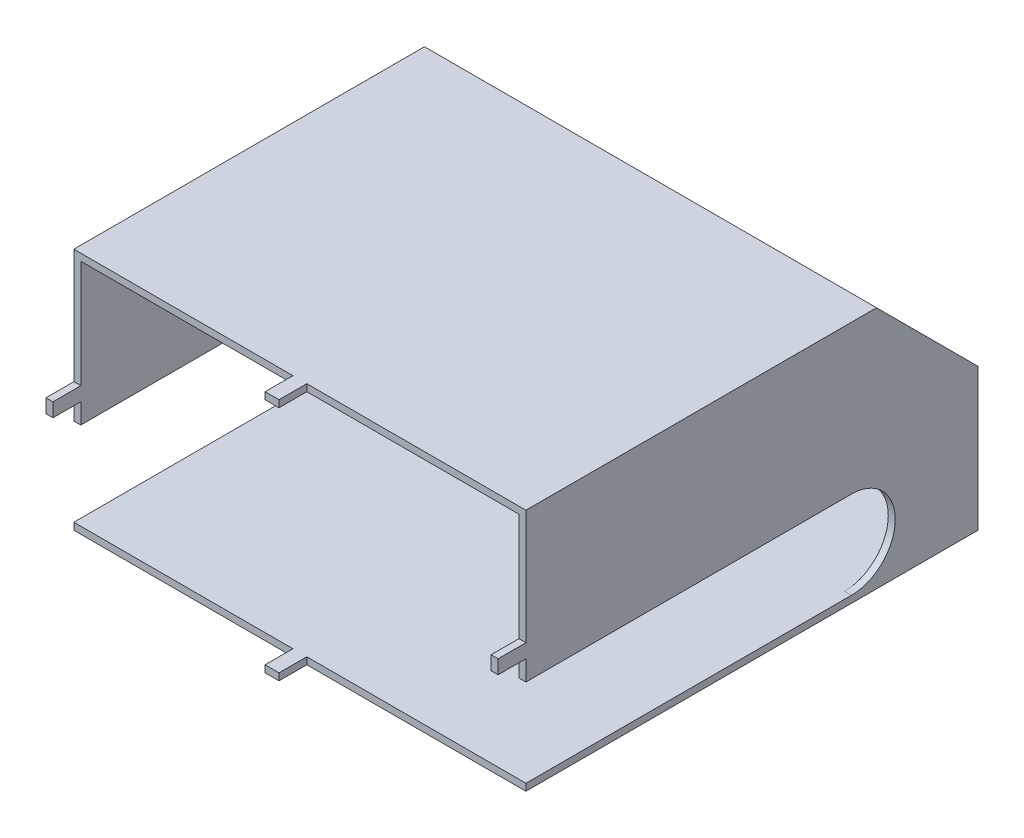
ISO-10303-21;
HEADER;
FILE_DESCRIPTION(('STEP AP214'),'2;1');
FILE_NAME('part.step','',(''),(''),'','','');
FILE_SCHEMA(('AUTOMOTIVE_DESIGN { 1 0 10303 214 1 1 1 1 }'));
ENDSEC;
DATA;
#1=APPLICATION_CONTEXT('core data for automotive mechanical design processes');
#2=APPLICATION_PROTOCOL_DEFINITION('international standard','automotive_design',2000,#1);
#3=PRODUCT_CONTEXT('',#1,'mechanical');
#4=PRODUCT('Part','Part','',(#3));
#5=PRODUCT_RELATED_PRODUCT_CATEGORY('part','',(#4));
#6=PRODUCT_DEFINITION_FORMATION('','',#4);
#7=PRODUCT_DEFINITION_CONTEXT('part definition',#1,'design');
#8=PRODUCT_DEFINITION('design','',#6,#7);
#9=PRODUCT_DEFINITION_SHAPE('','',#8);
#10=(LENGTH_UNIT() NAMED_UNIT(*) SI_UNIT(.MILLI.,.METRE.));
#11=(NAMED_UNIT(*) PLANE_ANGLE_UNIT() SI_UNIT($,.RADIAN.));
#12=(NAMED_UNIT(*) SI_UNIT($,.STERADIAN.) SOLID_ANGLE_UNIT());
#13=UNCERTAINTY_MEASURE_WITH_UNIT(LENGTH_MEASURE(1.E-05),#10,'distance_accuracy_value','');
#14=(GEOMETRIC_REPRESENTATION_CONTEXT(3) GLOBAL_UNCERTAINTY_ASSIGNED_CONTEXT((#13)) GLOBAL_UNIT_ASSIGNED_CONTEXT((#10,
#11,#12)) REPRESENTATION_CONTEXT('',''));
#15=CARTESIAN_POINT('',(0.,0.,0.));
#16=DIRECTION('',(0.,0.,1.));
#17=DIRECTION('',(1.,0.,0.));
#18=AXIS2_PLACEMENT_3D('',#15,#16,#17);
#19=CARTESIAN_POINT('',(-29.0877367896309,32.0672482552343,0.));
#20=DIRECTION('',(0.,0.,1.));
#21=DIRECTION('',(0.999999999999997,0.,0.));
#22=AXIS2_PLACEMENT_3D('',#19,#20,#21);
#23=PLANE('',#22);
#24=DIRECTION('',(0.,1.,0.));
#25=VECTOR('',#24,1.);
#26=CARTESIAN_POINT('',(-29.0877367896309,14.5672482552343,0.));
#27=LINE('',#26,#25);
#28=CARTESIAN_POINT('',(-29.0877367896311,21.3672482552343,0.));
#29=VERTEX_POINT('',#28);
#30=CARTESIAN_POINT('',(-29.087736789631,22.8172482552343,0.));
#31=VERTEX_POINT('',#30);
#32=EDGE_CURVE('E452',#29,#31,#27,.T.);
#33=ORIENTED_EDGE('',*,*,#32,.T.);
#34=DIRECTION('',(0.999999999999997,0.,0.));
#35=VECTOR('',#34,1.);
#36=CARTESIAN_POINT('',(-29.587736789631,22.8172482552343,0.));
#37=LINE('',#36,#35);
#38=CARTESIAN_POINT('',(-29.587736789631,22.8172482552343,0.));
#39=VERTEX_POINT('',#38);
#40=EDGE_CURVE('E282',#39,#31,#37,.T.);
#41=ORIENTED_EDGE('',*,*,#40,.F.);
#42=DIRECTION('',(0.,1.,0.));
#43=VECTOR('',#42,1.);
#44=CARTESIAN_POINT('',(-29.5877367896309,15.0672482552343,0.));
#45=LINE('',#44,#43);
#46=CARTESIAN_POINT('',(-29.5877367896311,21.3672482552343,0.));
#47=VERTEX_POINT('',#46);
#48=EDGE_CURVE('E423',#47,#39,#45,.T.);
#49=ORIENTED_EDGE('',*,*,#48,.F.);
#50=DIRECTION('',(-0.999999999999997,0.,0.));
#51=VECTOR('',#50,1.);
#52=CARTESIAN_POINT('',(-29.0877367896311,21.3672482552343,0.));
#53=LINE('',#52,#51);
#54=EDGE_CURVE('E401',#29,#47,#53,.T.);
#55=ORIENTED_EDGE('',*,*,#54,.F.);
#56=EDGE_LOOP('',(#33,#41,#49,#55));
#57=FACE_BOUND('',#56,.T.);
#58=ADVANCED_FACE('F32',(#57),#23,.T.);
#59=CARTESIAN_POINT('',(-29.587736789631,23.8172482552343,0.));
#60=VERTEX_POINT('',#59);
#61=CARTESIAN_POINT('',(-29.5877367896309,31.5672482552343,0.));
#62=VERTEX_POINT('',#61);
#63=EDGE_CURVE('E422',#60,#62,#45,.T.);
#64=ORIENTED_EDGE('',*,*,#63,.F.);
#65=DIRECTION('',(-0.999999999999997,0.,0.));
#66=VECTOR('',#65,1.);
#67=CARTESIAN_POINT('',(-29.587736789631,23.8172482552343,0.));
#68=LINE('',#67,#66);
#69=CARTESIAN_POINT('',(-29.087736789631,23.8172482552343,0.));
#70=VERTEX_POINT('',#69);
#71=EDGE_CURVE('E285',#70,#60,#68,.T.);
#72=ORIENTED_EDGE('',*,*,#71,.F.);
#73=CARTESIAN_POINT('',(-29.0877367896309,32.0672482552343,0.));
#74=VERTEX_POINT('',#73);
#75=EDGE_CURVE('E440',#70,#74,#27,.T.);
#76=ORIENTED_EDGE('',*,*,#75,.T.);
#77=DIRECTION('',(-0.999999999999997,0.,0.));
#78=VECTOR('',#77,1.);
#79=CARTESIAN_POINT('',(-29.0877367896309,32.0672482552343,0.));
#80=LINE('',#79,#78);
#81=CARTESIAN_POINT('',(-44.8377367896309,32.0672482552343,0.));
#82=VERTEX_POINT('',#81);
#83=EDGE_CURVE('E453',#74,#82,#80,.T.);
#84=ORIENTED_EDGE('',*,*,#83,.T.);
#85=DIRECTION('',(0.,1.,0.));
#86=VECTOR('',#85,1.);
#87=CARTESIAN_POINT('',(-44.8377367896309,32.0672482552343,0.));
#88=LINE('',#87,#86);
#89=CARTESIAN_POINT('',(-44.8377367896309,31.5672482552343,0.));
#90=VERTEX_POINT('',#89);
#91=EDGE_CURVE('E306',#90,#82,#88,.T.);
#92=ORIENTED_EDGE('',*,*,#91,.F.);
#93=DIRECTION('',(-0.999999999999997,0.,0.));
#94=VECTOR('',#93,1.);
#95=CARTESIAN_POINT('',(-29.5877367896309,31.5672482552343,0.));
#96=LINE('',#95,#94);
#97=EDGE_CURVE('E427',#62,#90,#96,.T.);
#98=ORIENTED_EDGE('',*,*,#97,.F.);
#99=EDGE_LOOP('',(#64,#72,#76,#84,#92,#98));
#100=FACE_BOUND('',#99,.T.);
#101=ADVANCED_FACE('F473',(#100),#23,.T.);
#102=CARTESIAN_POINT('',(-45.8377367896309,31.5672482552343,0.));
#103=VERTEX_POINT('',#102);
#104=CARTESIAN_POINT('',(-61.0877367896308,31.5672482552343,0.));
#105=VERTEX_POINT('',#104);
#106=EDGE_CURVE('E426',#103,#105,#96,.T.);
#107=ORIENTED_EDGE('',*,*,#106,.F.);
#108=DIRECTION('',(0.,-1.,0.));
#109=VECTOR('',#108,1.);
#110=CARTESIAN_POINT('',(-45.8377367896309,32.0672482552343,0.));
#111=LINE('',#110,#109);
#112=CARTESIAN_POINT('',(-45.8377367896309,32.0672482552343,0.));
#113=VERTEX_POINT('',#112);
#114=EDGE_CURVE('E303',#113,#103,#111,.T.);
#115=ORIENTED_EDGE('',*,*,#114,.F.);
#116=CARTESIAN_POINT('',(-61.5877367896308,32.0672482552343,0.));
#117=VERTEX_POINT('',#116);
#118=EDGE_CURVE('E451',#113,#117,#80,.T.);
#119=ORIENTED_EDGE('',*,*,#118,.T.);
#120=DIRECTION('',(0.,-1.,0.));
#121=VECTOR('',#120,1.);
#122=CARTESIAN_POINT('',(-61.5877367896308,32.0672482552343,0.));
#123=LINE('',#122,#121);
#124=CARTESIAN_POINT('',(-61.5877367896307,23.8172482552343,0.));
#125=VERTEX_POINT('',#124);
#126=EDGE_CURVE('E250',#117,#125,#123,.T.);
#127=ORIENTED_EDGE('',*,*,#126,.T.);
#128=DIRECTION('',(-0.999999999999997,0.,0.));
#129=VECTOR('',#128,1.);
#130=CARTESIAN_POINT('',(-61.5877367896307,23.8172482552343,0.));
#131=LINE('',#130,#129);
#132=CARTESIAN_POINT('',(-61.0877367896308,23.8172482552343,0.));
#133=VERTEX_POINT('',#132);
#134=EDGE_CURVE('E328',#133,#125,#131,.T.);
#135=ORIENTED_EDGE('',*,*,#134,.F.);
#136=DIRECTION('',(0.,-1.,0.));
#137=VECTOR('',#136,1.);
#138=CARTESIAN_POINT('',(-61.0877367896308,31.5672482552343,0.));
#139=LINE('',#138,#137);
#140=EDGE_CURVE('E415',#105,#133,#139,.T.);
#141=ORIENTED_EDGE('',*,*,#140,.F.);
#142=EDGE_LOOP('',(#107,#115,#119,#127,#135,#141));
#143=FACE_BOUND('',#142,.T.);
#144=ADVANCED_FACE('F510',(#143),#23,.T.);
#145=CARTESIAN_POINT('',(-61.0877367896308,22.8172482552343,0.));
#146=VERTEX_POINT('',#145);
#147=CARTESIAN_POINT('',(-61.0877367896308,21.3672482552343,0.));
#148=VERTEX_POINT('',#147);
#149=EDGE_CURVE('E414',#146,#148,#139,.T.);
#150=ORIENTED_EDGE('',*,*,#149,.F.);
#151=DIRECTION('',(0.999999999999997,0.,0.));
#152=VECTOR('',#151,1.);
#153=CARTESIAN_POINT('',(-61.5877367896308,22.8172482552343,0.));
#154=LINE('',#153,#152);
#155=CARTESIAN_POINT('',(-61.5877367896308,22.8172482552343,0.));
#156=VERTEX_POINT('',#155);
#157=EDGE_CURVE('E326',#156,#146,#154,.T.);
#158=ORIENTED_EDGE('',*,*,#157,.F.);
#159=CARTESIAN_POINT('',(-61.5877367896308,21.3672482552343,0.));
#160=VERTEX_POINT('',#159);
#161=EDGE_CURVE('E459',#156,#160,#123,.T.);
#162=ORIENTED_EDGE('',*,*,#161,.T.);
#163=EDGE_CURVE('E404',#148,#160,#53,.T.);
#164=ORIENTED_EDGE('',*,*,#163,.F.);
#165=EDGE_LOOP('',(#150,#158,#162,#164));
#166=FACE_BOUND('',#165,.T.);
#167=ADVANCED_FACE('F516',(#166),#23,.T.);
#168=DIRECTION('',(0.999999999999997,0.,0.));
#169=VECTOR('',#168,1.);
#170=CARTESIAN_POINT('',(-61.5877367896308,14.5672482552343,0.));
#171=LINE('',#170,#169);
#172=CARTESIAN_POINT('',(-61.5877367896308,14.5672482552343,0.));
#173=VERTEX_POINT('',#172);
#174=CARTESIAN_POINT('',(-45.8377367896309,14.5672482552343,0.));
#175=VERTEX_POINT('',#174);
#176=EDGE_CURVE('E460',#173,#175,#171,.T.);
#177=ORIENTED_EDGE('',*,*,#176,.T.);
#178=DIRECTION('',(0.,-1.,0.));
#179=VECTOR('',#178,1.);
#180=CARTESIAN_POINT('',(-45.8377367896309,15.0672482552343,0.));
#181=LINE('',#180,#179);
#182=CARTESIAN_POINT('',(-45.8377367896309,15.0672482552343,0.));
#183=VERTEX_POINT('',#182);
#184=EDGE_CURVE('E348',#183,#175,#181,.T.);
#185=ORIENTED_EDGE('',*,*,#184,.F.);
#186=DIRECTION('',(0.999999999999997,0.,0.));
#187=VECTOR('',#186,1.);
#188=CARTESIAN_POINT('',(-61.0877367896309,15.0672482552343,0.));
#189=LINE('',#188,#187);
#190=CARTESIAN_POINT('',(-61.5877367896309,15.0672482552343,0.));
#191=VERTEX_POINT('',#190);
#192=EDGE_CURVE('E419',#191,#183,#189,.T.);
#193=ORIENTED_EDGE('',*,*,#192,.F.);
#194=EDGE_CURVE('E456',#191,#173,#123,.T.);
#195=ORIENTED_EDGE('',*,*,#194,.T.);
#196=EDGE_LOOP('',(#177,#185,#193,#195));
#197=FACE_BOUND('',#196,.T.);
#198=ADVANCED_FACE('F506',(#197),#23,.T.);
#199=CARTESIAN_POINT('',(-44.8377367896309,15.0672482552343,0.));
#200=VERTEX_POINT('',#199);
#201=CARTESIAN_POINT('',(-29.0877367896309,15.0672482552343,0.));
#202=VERTEX_POINT('',#201);
#203=EDGE_CURVE('E418',#200,#202,#189,.T.);
#204=ORIENTED_EDGE('',*,*,#203,.F.);
#205=DIRECTION('',(0.,1.,0.));
#206=VECTOR('',#205,1.);
#207=CARTESIAN_POINT('',(-44.8377367896309,15.0672482552343,0.));
#208=LINE('',#207,#206);
#209=CARTESIAN_POINT('',(-44.8377367896309,14.5672482552343,0.));
#210=VERTEX_POINT('',#209);
#211=EDGE_CURVE('E350',#210,#200,#208,.T.);
#212=ORIENTED_EDGE('',*,*,#211,.F.);
#213=CARTESIAN_POINT('',(-29.0877367896309,14.5672482552343,0.));
#214=VERTEX_POINT('',#213);
#215=EDGE_CURVE('E458',#210,#214,#171,.T.);
#216=ORIENTED_EDGE('',*,*,#215,.T.);
#217=EDGE_CURVE('E448',#214,#202,#27,.T.);
#218=ORIENTED_EDGE('',*,*,#217,.T.);
#219=EDGE_LOOP('',(#204,#212,#216,#218));
#220=FACE_BOUND('',#219,.T.);
#221=ADVANCED_FACE('F515',(#220),#23,.T.);
#222=CARTESIAN_POINT('',(-29.0877367896309,14.5672482552343,-32.));
#223=DIRECTION('',(0.999999999999997,0.,0.));
#224=DIRECTION('',(0.,1.,0.));
#225=AXIS2_PLACEMENT_3D('',#222,#223,#224);
#226=PLANE('',#225);
#227=DIRECTION('',(0.,-1.,0.));
#228=VECTOR('',#227,1.);
#229=CARTESIAN_POINT('',(-29.0877367896309,32.0672482552343,-32.5));
#230=LINE('',#229,#228);
#231=CARTESIAN_POINT('',(-29.0877367896311,24.7743550364208,-32.5));
#232=VERTEX_POINT('',#231);
#233=CARTESIAN_POINT('',(-29.0877367896309,14.5672482552343,-32.5));
#234=VERTEX_POINT('',#233);
#235=EDGE_CURVE('E409',#232,#234,#230,.T.);
#236=ORIENTED_EDGE('',*,*,#235,.F.);
#237=DIRECTION('',(0.,-0.707106781186548,-0.707106781186548));
#238=VECTOR('',#237,1.);
#239=CARTESIAN_POINT('',(-29.0877367896311,24.7743550364208,-32.5));
#240=LINE('',#239,#238);
#241=CARTESIAN_POINT('',(-29.0877367896309,32.0672482552343,-25.2071067811866));
#242=VERTEX_POINT('',#241);
#243=EDGE_CURVE('E265',#242,#232,#240,.T.);
#244=ORIENTED_EDGE('',*,*,#243,.F.);
#245=DIRECTION('',(0.,0.,1.));
#246=VECTOR('',#245,1.);
#247=CARTESIAN_POINT('',(-29.0877367896309,32.0672482552343,-32.));
#248=LINE('',#247,#246);
#249=EDGE_CURVE('E255',#242,#74,#248,.T.);
#250=ORIENTED_EDGE('',*,*,#249,.T.);
#251=ORIENTED_EDGE('',*,*,#75,.F.);
#252=DIRECTION('',(0.,0.,-1.));
#253=VECTOR('',#252,1.);
#254=CARTESIAN_POINT('',(-29.087736789631,23.8172482552343,2.));
#255=LINE('',#254,#253);
#256=CARTESIAN_POINT('',(-29.087736789631,23.8172482552343,2.));
#257=VERTEX_POINT('',#256);
#258=EDGE_CURVE('E299',#257,#70,#255,.T.);
#259=ORIENTED_EDGE('',*,*,#258,.F.);
#260=DIRECTION('',(0.,1.,0.));
#261=VECTOR('',#260,1.);
#262=CARTESIAN_POINT('',(-29.087736789631,23.8172482552343,2.));
#263=LINE('',#262,#261);
#264=CARTESIAN_POINT('',(-29.087736789631,22.8172482552343,2.));
#265=VERTEX_POINT('',#264);
#266=EDGE_CURVE('E290',#265,#257,#263,.T.);
#267=ORIENTED_EDGE('',*,*,#266,.F.);
#268=DIRECTION('',(0.,0.,-1.));
#269=VECTOR('',#268,1.);
#270=CARTESIAN_POINT('',(-29.087736789631,22.8172482552343,2.));
#271=LINE('',#270,#269);
#272=EDGE_CURVE('E301',#265,#31,#271,.T.);
#273=ORIENTED_EDGE('',*,*,#272,.T.);
#274=ORIENTED_EDGE('',*,*,#32,.F.);
#275=DIRECTION('',(0.,0.,-1.));
#276=VECTOR('',#275,1.);
#277=CARTESIAN_POINT('',(-29.0877367896311,21.3672482552343,-23.4));
#278=LINE('',#277,#276);
#279=CARTESIAN_POINT('',(-29.0877367896311,21.3672482552343,-23.4));
#280=VERTEX_POINT('',#279);
#281=EDGE_CURVE('E385',#29,#280,#278,.T.);
#282=ORIENTED_EDGE('',*,*,#281,.T.);
#283=CARTESIAN_POINT('',(-29.087736789631,18.2172482552343,-23.4));
#284=DIRECTION('',(-0.999999999999997,0.,0.));
#285=DIRECTION('',(0.,0.,1.));
#286=AXIS2_PLACEMENT_3D('',#283,#284,#285);
#287=CIRCLE('',#286,3.15);
#288=CARTESIAN_POINT('',(-29.0877367896309,15.0672482552343,-23.4));
#289=VERTEX_POINT('',#288);
#290=EDGE_CURVE('E379',#280,#289,#287,.T.);
#291=ORIENTED_EDGE('',*,*,#290,.T.);
#292=DIRECTION('',(0.,0.,1.));
#293=VECTOR('',#292,1.);
#294=CARTESIAN_POINT('',(-29.0877367896309,15.0672482552343,-23.4));
#295=LINE('',#294,#293);
#296=EDGE_CURVE('E382',#289,#202,#295,.T.);
#297=ORIENTED_EDGE('',*,*,#296,.T.);
#298=ORIENTED_EDGE('',*,*,#217,.F.);
#299=DIRECTION('',(0.,0.,1.));
#300=VECTOR('',#299,1.);
#301=CARTESIAN_POINT('',(-29.0877367896309,14.5672482552343,-32.));
#302=LINE('',#301,#300);
#303=EDGE_CURVE('E40',#234,#214,#302,.T.);
#304=ORIENTED_EDGE('',*,*,#303,.F.);
#305=EDGE_LOOP('',(#236,#244,#250,#251,#259,#267,#273,#274,#282,#291,#297,#298,#304));
#306=FACE_BOUND('',#305,.T.);
#307=ADVANCED_FACE('F34',(#306),#226,.T.);
#308=CARTESIAN_POINT('',(-61.5877367896308,14.5672482552343,-32.0000000000001));
#309=DIRECTION('',(0.,-1.,0.));
#310=DIRECTION('',(0.,0.,-1.));
#311=AXIS2_PLACEMENT_3D('',#308,#309,#310);
#312=PLANE('',#311);
#313=ORIENTED_EDGE('',*,*,#176,.F.);
#314=DIRECTION('',(0.,0.,1.));
#315=VECTOR('',#314,1.);
#316=CARTESIAN_POINT('',(-61.5877367896308,14.5672482552343,-32.0000000000001));
#317=LINE('',#316,#315);
#318=CARTESIAN_POINT('',(-61.5877367896308,14.5672482552343,-32.5000000000001));
#319=VERTEX_POINT('',#318);
#320=EDGE_CURVE('E254',#319,#173,#317,.T.);
#321=ORIENTED_EDGE('',*,*,#320,.F.);
#322=DIRECTION('',(-0.999999999999997,0.,0.));
#323=VECTOR('',#322,1.);
#324=CARTESIAN_POINT('',(-11.5805953896194,14.5672482552343,-32.5));
#325=LINE('',#324,#323);
#326=EDGE_CURVE('E411',#234,#319,#325,.T.);
#327=ORIENTED_EDGE('',*,*,#326,.F.);
#328=ORIENTED_EDGE('',*,*,#303,.T.);
#329=ORIENTED_EDGE('',*,*,#215,.F.);
#330=DIRECTION('',(0.,0.,-1.));
#331=VECTOR('',#330,1.);
#332=CARTESIAN_POINT('',(-44.8377367896309,14.5672482552343,2.));
#333=LINE('',#332,#331);
#334=CARTESIAN_POINT('',(-44.8377367896309,14.5672482552343,2.));
#335=VERTEX_POINT('',#334);
#336=EDGE_CURVE('E364',#335,#210,#333,.T.);
#337=ORIENTED_EDGE('',*,*,#336,.F.);
#338=DIRECTION('',(0.999999999999997,0.,0.));
#339=VECTOR('',#338,1.);
#340=CARTESIAN_POINT('',(-45.8377367896309,14.5672482552343,2.00000000000001));
#341=LINE('',#340,#339);
#342=CARTESIAN_POINT('',(-45.8377367896309,14.5672482552343,2.00000000000001));
#343=VERTEX_POINT('',#342);
#344=EDGE_CURVE('E358',#343,#335,#341,.T.);
#345=ORIENTED_EDGE('',*,*,#344,.F.);
#346=DIRECTION('',(0.,0.,-1.));
#347=VECTOR('',#346,1.);
#348=CARTESIAN_POINT('',(-45.8377367896309,14.5672482552343,2.00000000000001));
#349=LINE('',#348,#347);
#350=EDGE_CURVE('E366',#343,#175,#349,.T.);
#351=ORIENTED_EDGE('',*,*,#350,.T.);
#352=EDGE_LOOP('',(#313,#321,#327,#328,#329,#337,#345,#351));
#353=FACE_BOUND('',#352,.T.);
#354=ADVANCED_FACE('F529',(#353),#312,.T.);
#355=CARTESIAN_POINT('',(-61.5877367896308,32.0672482552343,-32.));
#356=DIRECTION('',(-0.999999999999997,0.,0.));
#357=DIRECTION('',(0.,0.,1.));
#358=AXIS2_PLACEMENT_3D('',#355,#356,#357);
#359=PLANE('',#358);
#360=DIRECTION('',(0.,0.,1.));
#361=VECTOR('',#360,1.);
#362=CARTESIAN_POINT('',(-61.5877367896308,32.0672482552343,-32.));
#363=LINE('',#362,#361);
#364=CARTESIAN_POINT('',(-61.5877367896309,32.0672482552342,-25.2071067811865));
#365=VERTEX_POINT('',#364);
#366=EDGE_CURVE('E243',#365,#117,#363,.T.);
#367=ORIENTED_EDGE('',*,*,#366,.F.);
#368=DIRECTION('',(0.,-0.707106781186548,-0.707106781186548));
#369=VECTOR('',#368,1.);
#370=CARTESIAN_POINT('',(-61.5877367896308,24.7743550364208,-32.5));
#371=LINE('',#370,#369);
#372=CARTESIAN_POINT('',(-61.5877367896308,24.7743550364208,-32.5));
#373=VERTEX_POINT('',#372);
#374=EDGE_CURVE('E247',#365,#373,#371,.T.);
#375=ORIENTED_EDGE('',*,*,#374,.T.);
#376=DIRECTION('',(0.,-1.,0.));
#377=VECTOR('',#376,1.);
#378=CARTESIAN_POINT('',(-61.5877367896308,32.0672482552343,-32.5));
#379=LINE('',#378,#377);
#380=EDGE_CURVE('E407',#373,#319,#379,.T.);
#381=ORIENTED_EDGE('',*,*,#380,.T.);
#382=ORIENTED_EDGE('',*,*,#320,.T.);
#383=ORIENTED_EDGE('',*,*,#194,.F.);
#384=DIRECTION('',(0.,0.,1.));
#385=VECTOR('',#384,1.);
#386=CARTESIAN_POINT('',(-61.5877367896309,15.0672482552343,-23.4));
#387=LINE('',#386,#385);
#388=CARTESIAN_POINT('',(-61.5877367896309,15.0672482552343,-23.4));
#389=VERTEX_POINT('',#388);
#390=EDGE_CURVE('E374',#389,#191,#387,.T.);
#391=ORIENTED_EDGE('',*,*,#390,.F.);
#392=CARTESIAN_POINT('',(-61.5877367896309,18.2172482552343,-23.4));
#393=DIRECTION('',(-0.999999999999997,0.,0.));
#394=DIRECTION('',(0.,0.,1.));
#395=AXIS2_PLACEMENT_3D('',#392,#393,#394);
#396=CIRCLE('',#395,3.15);
#397=CARTESIAN_POINT('',(-61.5877367896308,21.3672482552343,-23.4));
#398=VERTEX_POINT('',#397);
#399=EDGE_CURVE('E371',#398,#389,#396,.T.);
#400=ORIENTED_EDGE('',*,*,#399,.F.);
#401=DIRECTION('',(0.,0.,-1.));
#402=VECTOR('',#401,1.);
#403=CARTESIAN_POINT('',(-61.5877367896308,21.3672482552343,-23.4));
#404=LINE('',#403,#402);
#405=EDGE_CURVE('E377',#160,#398,#404,.T.);
#406=ORIENTED_EDGE('',*,*,#405,.F.);
#407=ORIENTED_EDGE('',*,*,#161,.F.);
#408=DIRECTION('',(0.,0.,-1.));
#409=VECTOR('',#408,1.);
#410=CARTESIAN_POINT('',(-61.5877367896308,22.8172482552343,2.00000000000002));
#411=LINE('',#410,#409);
#412=CARTESIAN_POINT('',(-61.5877367896308,22.8172482552343,2.00000000000002));
#413=VERTEX_POINT('',#412);
#414=EDGE_CURVE('E339',#413,#156,#411,.T.);
#415=ORIENTED_EDGE('',*,*,#414,.F.);
#416=DIRECTION('',(0.,-1.,0.));
#417=VECTOR('',#416,1.);
#418=CARTESIAN_POINT('',(-61.5877367896307,23.8172482552343,2.));
#419=LINE('',#418,#417);
#420=CARTESIAN_POINT('',(-61.5877367896307,23.8172482552343,2.));
#421=VERTEX_POINT('',#420);
#422=EDGE_CURVE('E337',#421,#413,#419,.T.);
#423=ORIENTED_EDGE('',*,*,#422,.F.);
#424=DIRECTION('',(0.,0.,-1.));
#425=VECTOR('',#424,1.);
#426=CARTESIAN_POINT('',(-61.5877367896307,23.8172482552343,2.));
#427=LINE('',#426,#425);
#428=EDGE_CURVE('E341',#421,#125,#427,.T.);
#429=ORIENTED_EDGE('',*,*,#428,.T.);
#430=ORIENTED_EDGE('',*,*,#126,.F.);
#431=EDGE_LOOP('',(#367,#375,#381,#382,#383,#391,#400,#406,#407,#415,#423,#429,#430));
#432=FACE_BOUND('',#431,.T.);
#433=ADVANCED_FACE('F245',(#432),#359,.T.);
#434=CARTESIAN_POINT('',(-29.0877367896309,32.0672482552343,-32.));
#435=DIRECTION('',(0.,1.,0.));
#436=DIRECTION('',(-0.999999999999997,0.,0.));
#437=AXIS2_PLACEMENT_3D('',#434,#435,#436);
#438=PLANE('',#437);
#439=ORIENTED_EDGE('',*,*,#249,.F.);
#440=DIRECTION('',(-0.999999999999997,0.,0.));
#441=VECTOR('',#440,1.);
#442=CARTESIAN_POINT('',(-29.0877367896309,32.0672482552343,-25.2071067811866));
#443=LINE('',#442,#441);
#444=EDGE_CURVE('E258',#242,#365,#443,.T.);
#445=ORIENTED_EDGE('',*,*,#444,.T.);
#446=ORIENTED_EDGE('',*,*,#366,.T.);
#447=ORIENTED_EDGE('',*,*,#118,.F.);
#448=DIRECTION('',(0.,0.,-1.));
#449=VECTOR('',#448,1.);
#450=CARTESIAN_POINT('',(-45.8377367896309,32.0672482552343,2.));
#451=LINE('',#450,#449);
#452=CARTESIAN_POINT('',(-45.8377367896309,32.0672482552343,2.));
#453=VERTEX_POINT('',#452);
#454=EDGE_CURVE('E324',#453,#113,#451,.T.);
#455=ORIENTED_EDGE('',*,*,#454,.F.);
#456=DIRECTION('',(-0.999999999999997,0.,0.));
#457=VECTOR('',#456,1.);
#458=CARTESIAN_POINT('',(-45.8377367896309,32.0672482552343,2.));
#459=LINE('',#458,#457);
#460=CARTESIAN_POINT('',(-44.8377367896309,32.0672482552343,2.));
#461=VERTEX_POINT('',#460);
#462=EDGE_CURVE('E308',#461,#453,#459,.T.);
#463=ORIENTED_EDGE('',*,*,#462,.F.);
#464=DIRECTION('',(0.,0.,-1.));
#465=VECTOR('',#464,1.);
#466=CARTESIAN_POINT('',(-44.8377367896309,32.0672482552343,2.));
#467=LINE('',#466,#465);
#468=EDGE_CURVE('E317',#461,#82,#467,.T.);
#469=ORIENTED_EDGE('',*,*,#468,.T.);
#470=ORIENTED_EDGE('',*,*,#83,.F.);
#471=EDGE_LOOP('',(#439,#445,#446,#447,#455,#463,#469,#470));
#472=FACE_BOUND('',#471,.T.);
#473=ADVANCED_FACE('F259',(#472),#438,.T.);
#474=CARTESIAN_POINT('',(-61.0877367896308,31.5672482552343,-32.));
#475=DIRECTION('',(-0.999999999999997,0.,0.));
#476=DIRECTION('',(0.,0.,1.));
#477=AXIS2_PLACEMENT_3D('',#474,#475,#476);
#478=PLANE('',#477);
#479=DIRECTION('',(0.,-1.,0.));
#480=VECTOR('',#479,1.);
#481=CARTESIAN_POINT('',(-61.0877367896308,31.5672482552343,-32.));
#482=LINE('',#481,#480);
#483=CARTESIAN_POINT('',(-61.0877367896308,24.5672482552343,-32.));
#484=VERTEX_POINT('',#483);
#485=CARTESIAN_POINT('',(-61.0877367896308,15.0672482552343,-32.0000000000001));
#486=VERTEX_POINT('',#485);
#487=EDGE_CURVE('E430',#484,#486,#482,.T.);
#488=ORIENTED_EDGE('',*,*,#487,.F.);
#489=DIRECTION('',(0.,0.707106781186547,0.707106781186549));
#490=VECTOR('',#489,1.);
#491=CARTESIAN_POINT('',(-61.0877367896307,28.0672482552343,-28.5));
#492=LINE('',#491,#490);
#493=CARTESIAN_POINT('',(-61.0877367896308,31.5672482552343,-25.));
#494=VERTEX_POINT('',#493);
#495=EDGE_CURVE('E280',#484,#494,#492,.T.);
#496=ORIENTED_EDGE('',*,*,#495,.T.);
#497=DIRECTION('',(0.,0.,1.));
#498=VECTOR('',#497,1.);
#499=CARTESIAN_POINT('',(-61.0877367896308,31.5672482552343,-32.));
#500=LINE('',#499,#498);
#501=EDGE_CURVE('E438',#494,#105,#500,.T.);
#502=ORIENTED_EDGE('',*,*,#501,.T.);
#503=ORIENTED_EDGE('',*,*,#140,.T.);
#504=DIRECTION('',(0.,0.,-1.));
#505=VECTOR('',#504,1.);
#506=CARTESIAN_POINT('',(-61.0877367896308,23.8172482552343,2.));
#507=LINE('',#506,#505);
#508=CARTESIAN_POINT('',(-61.0877367896308,23.8172482552343,2.));
#509=VERTEX_POINT('',#508);
#510=EDGE_CURVE('E343',#509,#133,#507,.T.);
#511=ORIENTED_EDGE('',*,*,#510,.F.);
#512=DIRECTION('',(0.,1.,0.));
#513=VECTOR('',#512,1.);
#514=CARTESIAN_POINT('',(-61.0877367896308,23.8172482552343,2.));
#515=LINE('',#514,#513);
#516=CARTESIAN_POINT('',(-61.0877367896308,22.8172482552343,2.00000000000001));
#517=VERTEX_POINT('',#516);
#518=EDGE_CURVE('E333',#517,#509,#515,.T.);
#519=ORIENTED_EDGE('',*,*,#518,.F.);
#520=DIRECTION('',(0.,0.,-1.));
#521=VECTOR('',#520,1.);
#522=CARTESIAN_POINT('',(-61.0877367896308,22.8172482552343,2.00000000000001));
#523=LINE('',#522,#521);
#524=EDGE_CURVE('E345',#517,#146,#523,.T.);
#525=ORIENTED_EDGE('',*,*,#524,.T.);
#526=ORIENTED_EDGE('',*,*,#149,.T.);
#527=DIRECTION('',(0.,0.,-1.));
#528=VECTOR('',#527,1.);
#529=CARTESIAN_POINT('',(-61.0877367896309,21.3672482552343,-32.));
#530=LINE('',#529,#528);
#531=CARTESIAN_POINT('',(-61.0877367896308,21.3672482552343,-23.4));
#532=VERTEX_POINT('',#531);
#533=EDGE_CURVE('E403',#148,#532,#530,.T.);
#534=ORIENTED_EDGE('',*,*,#533,.T.);
#535=CARTESIAN_POINT('',(-61.0877367896309,18.2172482552343,-23.4));
#536=DIRECTION('',(-0.999999999999997,0.,0.));
#537=DIRECTION('',(0.,0.,1.));
#538=AXIS2_PLACEMENT_3D('',#535,#536,#537);
#539=CIRCLE('',#538,3.15);
#540=CARTESIAN_POINT('',(-61.0877367896309,15.0672482552343,-23.4));
#541=VERTEX_POINT('',#540);
#542=EDGE_CURVE('E398',#532,#541,#539,.T.);
#543=ORIENTED_EDGE('',*,*,#542,.T.);
#544=DIRECTION('',(0.,0.,1.));
#545=VECTOR('',#544,1.);
#546=CARTESIAN_POINT('',(-61.0877367896308,15.0672482552343,-32.0000000000001));
#547=LINE('',#546,#545);
#548=EDGE_CURVE('E437',#486,#541,#547,.T.);
#549=ORIENTED_EDGE('',*,*,#548,.F.);
#550=EDGE_LOOP('',(#488,#496,#502,#503,#511,#519,#525,#526,#534,#543,#549));
#551=FACE_BOUND('',#550,.T.);
#552=ADVANCED_FACE('F501',(#551),#478,.F.);
#553=CARTESIAN_POINT('',(-29.5877367896309,31.5672482552343,-32.0000000000001));
#554=DIRECTION('',(0.,1.,0.));
#555=DIRECTION('',(-0.999999999999997,0.,0.));
#556=AXIS2_PLACEMENT_3D('',#553,#554,#555);
#557=PLANE('',#556);
#558=ORIENTED_EDGE('',*,*,#501,.F.);
#559=DIRECTION('',(0.999999999999997,0.,0.));
#560=VECTOR('',#559,1.);
#561=CARTESIAN_POINT('',(-29.5877367896309,31.5672482552343,-25.));
#562=LINE('',#561,#560);
#563=CARTESIAN_POINT('',(-29.5877367896309,31.5672482552343,-25.));
#564=VERTEX_POINT('',#563);
#565=EDGE_CURVE('E278',#494,#564,#562,.T.);
#566=ORIENTED_EDGE('',*,*,#565,.T.);
#567=DIRECTION('',(0.,0.,1.));
#568=VECTOR('',#567,1.);
#569=CARTESIAN_POINT('',(-29.5877367896309,31.5672482552343,-32.0000000000001));
#570=LINE('',#569,#568);
#571=EDGE_CURVE('E441',#564,#62,#570,.T.);
#572=ORIENTED_EDGE('',*,*,#571,.T.);
#573=ORIENTED_EDGE('',*,*,#97,.T.);
#574=DIRECTION('',(0.,0.,-1.));
#575=VECTOR('',#574,1.);
#576=CARTESIAN_POINT('',(-44.8377367896309,31.5672482552343,2.));
#577=LINE('',#576,#575);
#578=CARTESIAN_POINT('',(-44.8377367896309,31.5672482552343,2.));
#579=VERTEX_POINT('',#578);
#580=EDGE_CURVE('E320',#579,#90,#577,.T.);
#581=ORIENTED_EDGE('',*,*,#580,.F.);
#582=DIRECTION('',(0.999999999999997,0.,0.));
#583=VECTOR('',#582,1.);
#584=CARTESIAN_POINT('',(-45.8377367896309,31.5672482552343,2.));
#585=LINE('',#584,#583);
#586=CARTESIAN_POINT('',(-45.8377367896309,31.5672482552343,2.));
#587=VERTEX_POINT('',#586);
#588=EDGE_CURVE('E313',#587,#579,#585,.T.);
#589=ORIENTED_EDGE('',*,*,#588,.F.);
#590=DIRECTION('',(0.,0.,-1.));
#591=VECTOR('',#590,1.);
#592=CARTESIAN_POINT('',(-45.8377367896309,31.5672482552343,2.));
#593=LINE('',#592,#591);
#594=EDGE_CURVE('E322',#587,#103,#593,.T.);
#595=ORIENTED_EDGE('',*,*,#594,.T.);
#596=ORIENTED_EDGE('',*,*,#106,.T.);
#597=EDGE_LOOP('',(#558,#566,#572,#573,#581,#589,#595,#596));
#598=FACE_BOUND('',#597,.T.);
#599=ADVANCED_FACE('F485',(#598),#557,.F.);
#600=CARTESIAN_POINT('',(-29.5877367896309,15.0672482552343,-32.));
#601=DIRECTION('',(0.999999999999997,0.,0.));
#602=DIRECTION('',(0.,0.,-1.));
#603=AXIS2_PLACEMENT_3D('',#600,#601,#602);
#604=PLANE('',#603);
#605=ORIENTED_EDGE('',*,*,#571,.F.);
#606=DIRECTION('',(0.,-0.707106781186547,-0.707106781186549));
#607=VECTOR('',#606,1.);
#608=CARTESIAN_POINT('',(-29.5877367896311,19.8172482552343,-36.75));
#609=LINE('',#608,#607);
#610=CARTESIAN_POINT('',(-29.5877367896311,24.5672482552343,-32.));
#611=VERTEX_POINT('',#610);
#612=EDGE_CURVE('E275',#564,#611,#609,.T.);
#613=ORIENTED_EDGE('',*,*,#612,.T.);
#614=DIRECTION('',(0.,1.,0.));
#615=VECTOR('',#614,1.);
#616=CARTESIAN_POINT('',(-29.5877367896309,15.0672482552343,-32.));
#617=LINE('',#616,#615);
#618=CARTESIAN_POINT('',(-29.5877367896309,15.0672482552343,-32.));
#619=VERTEX_POINT('',#618);
#620=EDGE_CURVE('E435',#619,#611,#617,.T.);
#621=ORIENTED_EDGE('',*,*,#620,.F.);
#622=DIRECTION('',(0.,0.,1.));
#623=VECTOR('',#622,1.);
#624=CARTESIAN_POINT('',(-29.5877367896309,15.0672482552343,-32.));
#625=LINE('',#624,#623);
#626=CARTESIAN_POINT('',(-29.5877367896309,15.0672482552343,-23.4));
#627=VERTEX_POINT('',#626);
#628=EDGE_CURVE('E443',#619,#627,#625,.T.);
#629=ORIENTED_EDGE('',*,*,#628,.T.);
#630=CARTESIAN_POINT('',(-29.587736789631,18.2172482552343,-23.4));
#631=DIRECTION('',(0.999999999999997,0.,0.));
#632=DIRECTION('',(0.,0.,-1.));
#633=AXIS2_PLACEMENT_3D('',#630,#631,#632);
#634=CIRCLE('',#633,3.15);
#635=CARTESIAN_POINT('',(-29.5877367896311,21.3672482552343,-23.4));
#636=VERTEX_POINT('',#635);
#637=EDGE_CURVE('E392',#627,#636,#634,.T.);
#638=ORIENTED_EDGE('',*,*,#637,.T.);
#639=DIRECTION('',(0.,0.,1.));
#640=VECTOR('',#639,1.);
#641=CARTESIAN_POINT('',(-29.5877367896311,21.3672482552343,-32.));
#642=LINE('',#641,#640);
#643=EDGE_CURVE('E11',#636,#47,#642,.T.);
#644=ORIENTED_EDGE('',*,*,#643,.T.);
#645=ORIENTED_EDGE('',*,*,#48,.T.);
#646=DIRECTION('',(0.,0.,-1.));
#647=VECTOR('',#646,1.);
#648=CARTESIAN_POINT('',(-29.587736789631,22.8172482552343,2.));
#649=LINE('',#648,#647);
#650=CARTESIAN_POINT('',(-29.587736789631,22.8172482552343,2.));
#651=VERTEX_POINT('',#650);
#652=EDGE_CURVE('E296',#651,#39,#649,.T.);
#653=ORIENTED_EDGE('',*,*,#652,.F.);
#654=DIRECTION('',(0.,-1.,0.));
#655=VECTOR('',#654,1.);
#656=CARTESIAN_POINT('',(-29.587736789631,23.8172482552343,2.));
#657=LINE('',#656,#655);
#658=CARTESIAN_POINT('',(-29.587736789631,23.8172482552343,2.));
#659=VERTEX_POINT('',#658);
#660=EDGE_CURVE('E294',#659,#651,#657,.T.);
#661=ORIENTED_EDGE('',*,*,#660,.F.);
#662=DIRECTION('',(0.,0.,-1.));
#663=VECTOR('',#662,1.);
#664=CARTESIAN_POINT('',(-29.587736789631,23.8172482552343,2.));
#665=LINE('',#664,#663);
#666=EDGE_CURVE('E55',#659,#60,#665,.T.);
#667=ORIENTED_EDGE('',*,*,#666,.T.);
#668=ORIENTED_EDGE('',*,*,#63,.T.);
#669=EDGE_LOOP('',(#605,#613,#621,#629,#638,#644,#645,#653,#661,#667,#668));
#670=FACE_BOUND('',#669,.T.);
#671=ADVANCED_FACE('F490',(#670),#604,.F.);
#672=CARTESIAN_POINT('',(-61.0877367896308,15.0672482552343,-32.0000000000001));
#673=DIRECTION('',(0.,-1.,0.));
#674=DIRECTION('',(0.,0.,-1.));
#675=AXIS2_PLACEMENT_3D('',#672,#673,#674);
#676=PLANE('',#675);
#677=ORIENTED_EDGE('',*,*,#192,.T.);
#678=DIRECTION('',(0.,0.,-1.));
#679=VECTOR('',#678,1.);
#680=CARTESIAN_POINT('',(-45.8377367896309,15.0672482552343,2.));
#681=LINE('',#680,#679);
#682=CARTESIAN_POINT('',(-45.8377367896309,15.0672482552343,2.));
#683=VERTEX_POINT('',#682);
#684=EDGE_CURVE('E369',#683,#183,#681,.T.);
#685=ORIENTED_EDGE('',*,*,#684,.F.);
#686=DIRECTION('',(-0.999999999999997,0.,0.));
#687=VECTOR('',#686,1.);
#688=CARTESIAN_POINT('',(-45.8377367896309,15.0672482552343,2.));
#689=LINE('',#688,#687);
#690=CARTESIAN_POINT('',(-44.8377367896309,15.0672482552343,2.));
#691=VERTEX_POINT('',#690);
#692=EDGE_CURVE('E353',#691,#683,#689,.T.);
#693=ORIENTED_EDGE('',*,*,#692,.F.);
#694=DIRECTION('',(0.,0.,-1.));
#695=VECTOR('',#694,1.);
#696=CARTESIAN_POINT('',(-44.8377367896309,15.0672482552343,2.));
#697=LINE('',#696,#695);
#698=EDGE_CURVE('E362',#691,#200,#697,.T.);
#699=ORIENTED_EDGE('',*,*,#698,.T.);
#700=ORIENTED_EDGE('',*,*,#203,.T.);
#701=ORIENTED_EDGE('',*,*,#296,.F.);
#702=DIRECTION('',(-0.999999999999997,0.,0.));
#703=VECTOR('',#702,1.);
#704=CARTESIAN_POINT('',(-29.0877367896309,15.0672482552343,-23.4));
#705=LINE('',#704,#703);
#706=EDGE_CURVE('E394',#289,#627,#705,.T.);
#707=ORIENTED_EDGE('',*,*,#706,.T.);
#708=ORIENTED_EDGE('',*,*,#628,.F.);
#709=DIRECTION('',(0.999999999999997,0.,0.));
#710=VECTOR('',#709,1.);
#711=CARTESIAN_POINT('',(-61.0877367896308,15.0672482552343,-32.0000000000001));
#712=LINE('',#711,#710);
#713=EDGE_CURVE('E432',#486,#619,#712,.T.);
#714=ORIENTED_EDGE('',*,*,#713,.F.);
#715=ORIENTED_EDGE('',*,*,#548,.T.);
#716=EDGE_CURVE('E388',#541,#389,#705,.T.);
#717=ORIENTED_EDGE('',*,*,#716,.T.);
#718=ORIENTED_EDGE('',*,*,#390,.T.);
#719=EDGE_LOOP('',(#677,#685,#693,#699,#700,#701,#707,#708,#714,#715,#717,#718));
#720=FACE_BOUND('',#719,.T.);
#721=ADVANCED_FACE('F492',(#720),#676,.F.);
#722=CARTESIAN_POINT('',(-11.5805953896194,32.0672482552343,-32.));
#723=DIRECTION('',(0.,0.,1.));
#724=DIRECTION('',(0.999999999999997,0.,0.));
#725=AXIS2_PLACEMENT_3D('',#722,#723,#724);
#726=PLANE('',#725);
#727=DIRECTION('',(0.999999999999997,0.,0.));
#728=VECTOR('',#727,1.);
#729=CARTESIAN_POINT('',(-11.5805953896195,24.5672482552343,-32.));
#730=LINE('',#729,#728);
#731=EDGE_CURVE('E47',#484,#611,#730,.T.);
#732=ORIENTED_EDGE('',*,*,#731,.F.);
#733=ORIENTED_EDGE('',*,*,#487,.T.);
#734=ORIENTED_EDGE('',*,*,#713,.T.);
#735=ORIENTED_EDGE('',*,*,#620,.T.);
#736=EDGE_LOOP('',(#732,#733,#734,#735));
#737=FACE_BOUND('',#736,.T.);
#738=ADVANCED_FACE('F498',(#737),#726,.T.);
#739=CARTESIAN_POINT('',(-11.5805953896194,32.0672482552343,-32.5));
#740=DIRECTION('',(0.,0.,-1.));
#741=DIRECTION('',(0.,1.,0.));
#742=AXIS2_PLACEMENT_3D('',#739,#740,#741);
#743=PLANE('',#742);
#744=ORIENTED_EDGE('',*,*,#380,.F.);
#745=DIRECTION('',(-0.999999999999997,0.,0.));
#746=VECTOR('',#745,1.);
#747=CARTESIAN_POINT('',(-29.0877367896311,24.7743550364208,-32.5));
#748=LINE('',#747,#746);
#749=EDGE_CURVE('E264',#232,#373,#748,.T.);
#750=ORIENTED_EDGE('',*,*,#749,.F.);
#751=ORIENTED_EDGE('',*,*,#235,.T.);
#752=ORIENTED_EDGE('',*,*,#326,.T.);
#753=EDGE_LOOP('',(#744,#750,#751,#752));
#754=FACE_BOUND('',#753,.T.);
#755=ADVANCED_FACE('F615',(#754),#743,.T.);
#756=CARTESIAN_POINT('',(-29.0877367896311,21.3672482552343,-23.4));
#757=DIRECTION('',(0.,1.,0.));
#758=DIRECTION('',(0.,0.,1.));
#759=AXIS2_PLACEMENT_3D('',#756,#757,#758);
#760=PLANE('',#759);
#761=ORIENTED_EDGE('',*,*,#54,.T.);
#762=ORIENTED_EDGE('',*,*,#643,.F.);
#763=DIRECTION('',(-0.999999999999997,0.,0.));
#764=VECTOR('',#763,1.);
#765=CARTESIAN_POINT('',(-29.0877367896311,21.3672482552343,-23.4));
#766=LINE('',#765,#764);
#767=EDGE_CURVE('E389',#280,#636,#766,.T.);
#768=ORIENTED_EDGE('',*,*,#767,.F.);
#769=ORIENTED_EDGE('',*,*,#281,.F.);
#770=EDGE_LOOP('',(#761,#762,#768,#769));
#771=FACE_BOUND('',#770,.T.);
#772=ADVANCED_FACE('F611',(#771),#760,.F.);
#773=CARTESIAN_POINT('',(-29.087736789631,18.2172482552343,-23.4));
#774=DIRECTION('',(-0.999999999999997,0.,0.));
#775=DIRECTION('',(0.,0.,1.));
#776=AXIS2_PLACEMENT_3D('',#773,#774,#775);
#777=CYLINDRICAL_SURFACE('',#776,3.15);
#778=ORIENTED_EDGE('',*,*,#706,.F.);
#779=ORIENTED_EDGE('',*,*,#290,.F.);
#780=ORIENTED_EDGE('',*,*,#767,.T.);
#781=ORIENTED_EDGE('',*,*,#637,.F.);
#782=EDGE_LOOP('',(#778,#779,#780,#781));
#783=FACE_BOUND('',#782,.T.);
#784=ADVANCED_FACE('F614',(#783),#777,.F.);
#785=ORIENTED_EDGE('',*,*,#163,.T.);
#786=ORIENTED_EDGE('',*,*,#405,.T.);
#787=EDGE_CURVE('E393',#532,#398,#766,.T.);
#788=ORIENTED_EDGE('',*,*,#787,.F.);
#789=ORIENTED_EDGE('',*,*,#533,.F.);
#790=EDGE_LOOP('',(#785,#786,#788,#789));
#791=FACE_BOUND('',#790,.T.);
#792=ADVANCED_FACE('F549',(#791),#760,.F.);
#793=ORIENTED_EDGE('',*,*,#787,.T.);
#794=ORIENTED_EDGE('',*,*,#399,.T.);
#795=ORIENTED_EDGE('',*,*,#716,.F.);
#796=ORIENTED_EDGE('',*,*,#542,.F.);
#797=EDGE_LOOP('',(#793,#794,#795,#796));
#798=FACE_BOUND('',#797,.T.);
#799=ADVANCED_FACE('F553',(#798),#777,.F.);
#800=CARTESIAN_POINT('',(-45.8377367896309,15.0672482552343,2.));
#801=DIRECTION('',(0.999999999999997,0.,0.));
#802=DIRECTION('',(0.,0.,-1.));
#803=AXIS2_PLACEMENT_3D('',#800,#801,#802);
#804=PLANE('',#803);
#805=ORIENTED_EDGE('',*,*,#184,.T.);
#806=ORIENTED_EDGE('',*,*,#350,.F.);
#807=DIRECTION('',(0.,-1.,0.));
#808=VECTOR('',#807,1.);
#809=CARTESIAN_POINT('',(-45.8377367896309,15.0672482552343,2.));
#810=LINE('',#809,#808);
#811=EDGE_CURVE('E356',#683,#343,#810,.T.);
#812=ORIENTED_EDGE('',*,*,#811,.F.);
#813=ORIENTED_EDGE('',*,*,#684,.T.);
#814=EDGE_LOOP('',(#805,#806,#812,#813));
#815=FACE_BOUND('',#814,.T.);
#816=ADVANCED_FACE('F535',(#815),#804,.F.);
#817=CARTESIAN_POINT('',(-44.8377367896309,15.0672482552343,2.));
#818=DIRECTION('',(-0.999999999999997,0.,0.));
#819=DIRECTION('',(0.,0.,1.));
#820=AXIS2_PLACEMENT_3D('',#817,#818,#819);
#821=PLANE('',#820);
#822=ORIENTED_EDGE('',*,*,#211,.T.);
#823=ORIENTED_EDGE('',*,*,#698,.F.);
#824=DIRECTION('',(0.,1.,0.));
#825=VECTOR('',#824,1.);
#826=CARTESIAN_POINT('',(-44.8377367896309,15.0672482552343,2.));
#827=LINE('',#826,#825);
#828=EDGE_CURVE('E360',#335,#691,#827,.T.);
#829=ORIENTED_EDGE('',*,*,#828,.F.);
#830=ORIENTED_EDGE('',*,*,#336,.T.);
#831=EDGE_LOOP('',(#822,#823,#829,#830));
#832=FACE_BOUND('',#831,.T.);
#833=ADVANCED_FACE('F604',(#832),#821,.F.);
#834=CARTESIAN_POINT('',(-44.8377367896309,15.0672482552343,2.));
#835=DIRECTION('',(0.,0.,-1.));
#836=DIRECTION('',(-0.999999999999997,0.,0.));
#837=AXIS2_PLACEMENT_3D('',#834,#835,#836);
#838=PLANE('',#837);
#839=ORIENTED_EDGE('',*,*,#692,.T.);
#840=ORIENTED_EDGE('',*,*,#811,.T.);
#841=ORIENTED_EDGE('',*,*,#344,.T.);
#842=ORIENTED_EDGE('',*,*,#828,.T.);
#843=EDGE_LOOP('',(#839,#840,#841,#842));
#844=FACE_BOUND('',#843,.T.);
#845=ADVANCED_FACE('F601',(#844),#838,.F.);
#846=CARTESIAN_POINT('',(-61.5877367896308,22.8172482552343,2.00000000000002));
#847=DIRECTION('',(0.,1.,0.));
#848=DIRECTION('',(0.,0.,1.));
#849=AXIS2_PLACEMENT_3D('',#846,#847,#848);
#850=PLANE('',#849);
#851=ORIENTED_EDGE('',*,*,#157,.T.);
#852=ORIENTED_EDGE('',*,*,#524,.F.);
#853=DIRECTION('',(0.999999999999997,0.,0.));
#854=VECTOR('',#853,1.);
#855=CARTESIAN_POINT('',(-61.5877367896308,22.8172482552343,2.00000000000002));
#856=LINE('',#855,#854);
#857=EDGE_CURVE('E330',#413,#517,#856,.T.);
#858=ORIENTED_EDGE('',*,*,#857,.F.);
#859=ORIENTED_EDGE('',*,*,#414,.T.);
#860=EDGE_LOOP('',(#851,#852,#858,#859));
#861=FACE_BOUND('',#860,.T.);
#862=ADVANCED_FACE('F560',(#861),#850,.F.);
#863=CARTESIAN_POINT('',(-61.5877367896307,23.8172482552343,2.));
#864=DIRECTION('',(0.,-1.,0.));
#865=DIRECTION('',(0.,0.,-1.));
#866=AXIS2_PLACEMENT_3D('',#863,#864,#865);
#867=PLANE('',#866);
#868=ORIENTED_EDGE('',*,*,#134,.T.);
#869=ORIENTED_EDGE('',*,*,#428,.F.);
#870=DIRECTION('',(-0.999999999999997,0.,0.));
#871=VECTOR('',#870,1.);
#872=CARTESIAN_POINT('',(-61.5877367896307,23.8172482552343,2.));
#873=LINE('',#872,#871);
#874=EDGE_CURVE('E335',#509,#421,#873,.T.);
#875=ORIENTED_EDGE('',*,*,#874,.F.);
#876=ORIENTED_EDGE('',*,*,#510,.T.);
#877=EDGE_LOOP('',(#868,#869,#875,#876));
#878=FACE_BOUND('',#877,.T.);
#879=ADVANCED_FACE('F567',(#878),#867,.F.);
#880=CARTESIAN_POINT('',(-61.0877367896308,22.8172482552343,2.00000000000001));
#881=DIRECTION('',(0.,0.,-1.));
#882=DIRECTION('',(-0.999999999999997,0.,0.));
#883=AXIS2_PLACEMENT_3D('',#880,#881,#882);
#884=PLANE('',#883);
#885=ORIENTED_EDGE('',*,*,#857,.T.);
#886=ORIENTED_EDGE('',*,*,#518,.T.);
#887=ORIENTED_EDGE('',*,*,#874,.T.);
#888=ORIENTED_EDGE('',*,*,#422,.T.);
#889=EDGE_LOOP('',(#885,#886,#887,#888));
#890=FACE_BOUND('',#889,.T.);
#891=ADVANCED_FACE('F564',(#890),#884,.F.);
#892=CARTESIAN_POINT('',(-45.8377367896309,32.0672482552343,2.));
#893=DIRECTION('',(0.999999999999997,0.,0.));
#894=DIRECTION('',(0.,0.,-1.));
#895=AXIS2_PLACEMENT_3D('',#892,#893,#894);
#896=PLANE('',#895);
#897=ORIENTED_EDGE('',*,*,#114,.T.);
#898=ORIENTED_EDGE('',*,*,#594,.F.);
#899=DIRECTION('',(0.,-1.,0.));
#900=VECTOR('',#899,1.);
#901=CARTESIAN_POINT('',(-45.8377367896309,32.0672482552343,2.));
#902=LINE('',#901,#900);
#903=EDGE_CURVE('E311',#453,#587,#902,.T.);
#904=ORIENTED_EDGE('',*,*,#903,.F.);
#905=ORIENTED_EDGE('',*,*,#454,.T.);
#906=EDGE_LOOP('',(#897,#898,#904,#905));
#907=FACE_BOUND('',#906,.T.);
#908=ADVANCED_FACE('F577',(#907),#896,.F.);
#909=CARTESIAN_POINT('',(-44.8377367896309,32.0672482552343,2.));
#910=DIRECTION('',(-0.999999999999997,0.,0.));
#911=DIRECTION('',(0.,0.,1.));
#912=AXIS2_PLACEMENT_3D('',#909,#910,#911);
#913=PLANE('',#912);
#914=ORIENTED_EDGE('',*,*,#91,.T.);
#915=ORIENTED_EDGE('',*,*,#468,.F.);
#916=DIRECTION('',(0.,1.,0.));
#917=VECTOR('',#916,1.);
#918=CARTESIAN_POINT('',(-44.8377367896309,32.0672482552343,2.));
#919=LINE('',#918,#917);
#920=EDGE_CURVE('E315',#579,#461,#919,.T.);
#921=ORIENTED_EDGE('',*,*,#920,.F.);
#922=ORIENTED_EDGE('',*,*,#580,.T.);
#923=EDGE_LOOP('',(#914,#915,#921,#922));
#924=FACE_BOUND('',#923,.T.);
#925=ADVANCED_FACE('F480',(#924),#913,.F.);
#926=CARTESIAN_POINT('',(-44.8377367896309,32.0672482552343,2.));
#927=DIRECTION('',(0.,0.,-1.));
#928=DIRECTION('',(-0.999999999999997,0.,0.));
#929=AXIS2_PLACEMENT_3D('',#926,#927,#928);
#930=PLANE('',#929);
#931=ORIENTED_EDGE('',*,*,#462,.T.);
#932=ORIENTED_EDGE('',*,*,#903,.T.);
#933=ORIENTED_EDGE('',*,*,#588,.T.);
#934=ORIENTED_EDGE('',*,*,#920,.T.);
#935=EDGE_LOOP('',(#931,#932,#933,#934));
#936=FACE_BOUND('',#935,.T.);
#937=ADVANCED_FACE('F579',(#936),#930,.F.);
#938=CARTESIAN_POINT('',(-29.587736789631,22.8172482552343,2.));
#939=DIRECTION('',(0.,1.,0.));
#940=DIRECTION('',(0.,0.,1.));
#941=AXIS2_PLACEMENT_3D('',#938,#939,#940);
#942=PLANE('',#941);
#943=ORIENTED_EDGE('',*,*,#40,.T.);
#944=ORIENTED_EDGE('',*,*,#272,.F.);
#945=DIRECTION('',(0.999999999999997,0.,0.));
#946=VECTOR('',#945,1.);
#947=CARTESIAN_POINT('',(-29.587736789631,22.8172482552343,2.));
#948=LINE('',#947,#946);
#949=EDGE_CURVE('E287',#651,#265,#948,.T.);
#950=ORIENTED_EDGE('',*,*,#949,.F.);
#951=ORIENTED_EDGE('',*,*,#652,.T.);
#952=EDGE_LOOP('',(#943,#944,#950,#951));
#953=FACE_BOUND('',#952,.T.);
#954=ADVANCED_FACE('F581',(#953),#942,.F.);
#955=CARTESIAN_POINT('',(-29.587736789631,23.8172482552343,2.));
#956=DIRECTION('',(0.,-1.,0.));
#957=DIRECTION('',(0.,0.,-1.));
#958=AXIS2_PLACEMENT_3D('',#955,#956,#957);
#959=PLANE('',#958);
#960=ORIENTED_EDGE('',*,*,#71,.T.);
#961=ORIENTED_EDGE('',*,*,#666,.F.);
#962=DIRECTION('',(-0.999999999999997,0.,0.));
#963=VECTOR('',#962,1.);
#964=CARTESIAN_POINT('',(-29.587736789631,23.8172482552343,2.));
#965=LINE('',#964,#963);
#966=EDGE_CURVE('E292',#257,#659,#965,.T.);
#967=ORIENTED_EDGE('',*,*,#966,.F.);
#968=ORIENTED_EDGE('',*,*,#258,.T.);
#969=EDGE_LOOP('',(#960,#961,#967,#968));
#970=FACE_BOUND('',#969,.T.);
#971=ADVANCED_FACE('F587',(#970),#959,.F.);
#972=CARTESIAN_POINT('',(-29.087736789631,22.8172482552343,2.));
#973=DIRECTION('',(0.,0.,-1.));
#974=DIRECTION('',(-0.999999999999997,0.,0.));
#975=AXIS2_PLACEMENT_3D('',#972,#973,#974);
#976=PLANE('',#975);
#977=ORIENTED_EDGE('',*,*,#949,.T.);
#978=ORIENTED_EDGE('',*,*,#266,.T.);
#979=ORIENTED_EDGE('',*,*,#966,.T.);
#980=ORIENTED_EDGE('',*,*,#660,.T.);
#981=EDGE_LOOP('',(#977,#978,#979,#980));
#982=FACE_BOUND('',#981,.T.);
#983=ADVANCED_FACE('F646',(#982),#976,.F.);
#984=CARTESIAN_POINT('',(-29.0877367896311,24.7743550364208,-32.5));
#985=DIRECTION('',(0.,0.707106781186548,-0.707106781186548));
#986=DIRECTION('',(0.,0.707106781186548,0.707106781186548));
#987=AXIS2_PLACEMENT_3D('',#984,#985,#986);
#988=PLANE('',#987);
#989=ORIENTED_EDGE('',*,*,#374,.F.);
#990=ORIENTED_EDGE('',*,*,#444,.F.);
#991=ORIENTED_EDGE('',*,*,#243,.T.);
#992=ORIENTED_EDGE('',*,*,#749,.T.);
#993=EDGE_LOOP('',(#989,#990,#991,#992));
#994=FACE_BOUND('',#993,.T.);
#995=ADVANCED_FACE('F268',(#994),#988,.T.);
#996=CARTESIAN_POINT('',(-29.0877367896311,24.0672482552343,-32.5));
#997=DIRECTION('',(0.,-0.707106781186549,0.707106781186546));
#998=DIRECTION('',(0.,-0.707106781186546,-0.707106781186549));
#999=AXIS2_PLACEMENT_3D('',#996,#997,#998);
#1000=PLANE('',#999);
#1001=ORIENTED_EDGE('',*,*,#495,.F.);
#1002=ORIENTED_EDGE('',*,*,#731,.T.);
#1003=ORIENTED_EDGE('',*,*,#612,.F.);
#1004=ORIENTED_EDGE('',*,*,#565,.F.);
#1005=EDGE_LOOP('',(#1001,#1002,#1003,#1004));
#1006=FACE_BOUND('',#1005,.T.);
#1007=ADVANCED_FACE('F640',(#1006),#1000,.T.);
#1008=CLOSED_SHELL('',(#58,#101,#144,#167,#198,#221,#307,#354,#433,#473,#552,#599,#671,#721,
#738,#755,#772,#784,#792,#799,#816,#833,#845,#862,#879,#891,#908,#925,#937,#954,#971,#983,#995,#1007));
#1009=MANIFOLD_SOLID_BREP('B2',#1008);
#1010=ADVANCED_BREP_SHAPE_REPRESENTATION('',(#18,#1009),#14);
#1011=SHAPE_DEFINITION_REPRESENTATION(#9,#1010);
ENDSEC;
END-ISO-10303-21;
